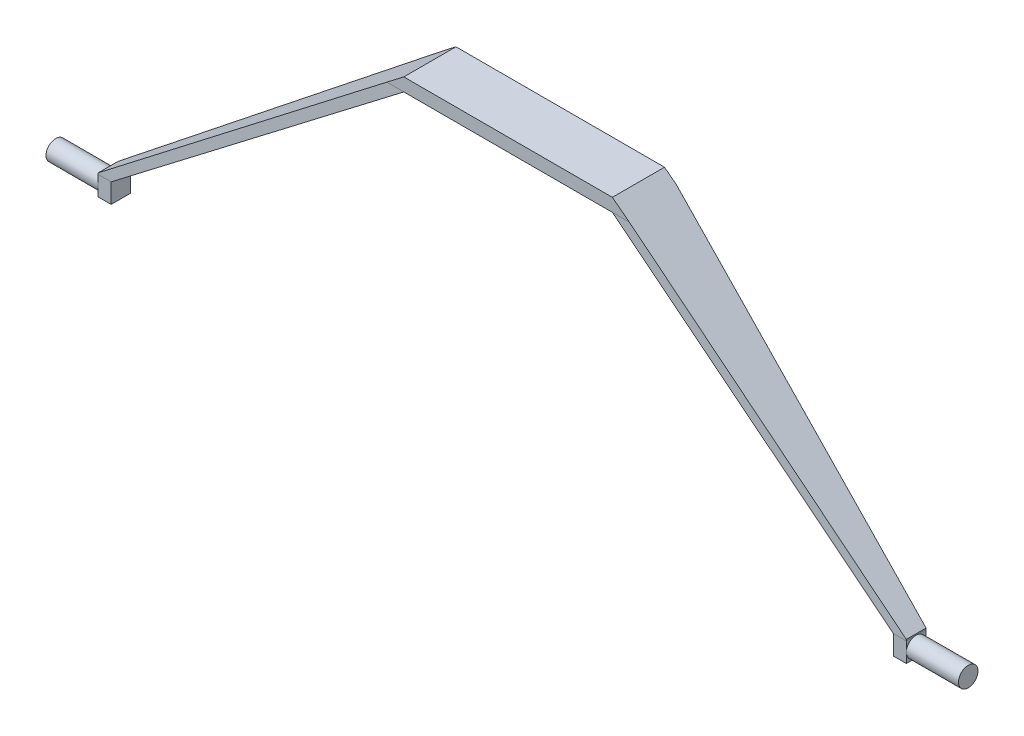
ISO-10303-21;
HEADER;
FILE_DESCRIPTION(('STEP AP214'),'2;1');
FILE_NAME('part.step','',(''),(''),'','','');
FILE_SCHEMA(('AUTOMOTIVE_DESIGN { 1 0 10303 214 1 1 1 1 }'));
ENDSEC;
DATA;
#1=APPLICATION_CONTEXT('core data for automotive mechanical design processes');
#2=APPLICATION_PROTOCOL_DEFINITION('international standard','automotive_design',2000,#1);
#3=PRODUCT_CONTEXT('',#1,'mechanical');
#4=PRODUCT('Part','Part','',(#3));
#5=PRODUCT_RELATED_PRODUCT_CATEGORY('part','',(#4));
#6=PRODUCT_DEFINITION_FORMATION('','',#4);
#7=PRODUCT_DEFINITION_CONTEXT('part definition',#1,'design');
#8=PRODUCT_DEFINITION('design','',#6,#7);
#9=PRODUCT_DEFINITION_SHAPE('','',#8);
#10=(LENGTH_UNIT() NAMED_UNIT(*) SI_UNIT(.MILLI.,.METRE.));
#11=(NAMED_UNIT(*) PLANE_ANGLE_UNIT() SI_UNIT($,.RADIAN.));
#12=(NAMED_UNIT(*) SI_UNIT($,.STERADIAN.) SOLID_ANGLE_UNIT());
#13=UNCERTAINTY_MEASURE_WITH_UNIT(LENGTH_MEASURE(1.E-05),#10,'distance_accuracy_value','');
#14=(GEOMETRIC_REPRESENTATION_CONTEXT(3) GLOBAL_UNCERTAINTY_ASSIGNED_CONTEXT((#13)) GLOBAL_UNIT_ASSIGNED_CONTEXT((#10,
#11,#12)) REPRESENTATION_CONTEXT('',''));
#15=CARTESIAN_POINT('',(0.,0.,0.));
#16=DIRECTION('',(0.,0.,1.));
#17=DIRECTION('',(1.,0.,0.));
#18=AXIS2_PLACEMENT_3D('',#15,#16,#17);
#19=CARTESIAN_POINT('',(0.,215.9,11.43));
#20=DIRECTION('',(0.,-1.,0.));
#21=DIRECTION('',(1.,0.,0.));
#22=AXIS2_PLACEMENT_3D('',#19,#20,#21);
#23=PLANE('',#22);
#24=DIRECTION('',(0.,0.,-1.));
#25=VECTOR('',#24,1.);
#26=CARTESIAN_POINT('',(-203.2,215.9,11.43));
#27=LINE('',#26,#25);
#28=CARTESIAN_POINT('',(-203.2,215.9,0.));
#29=VERTEX_POINT('',#28);
#30=CARTESIAN_POINT('',(-203.2,215.9,-100.20306796752));
#31=VERTEX_POINT('',#30);
#32=EDGE_CURVE('E184',#29,#31,#27,.T.);
#33=ORIENTED_EDGE('',*,*,#32,.T.);
#34=DIRECTION('',(-1.,0.,0.));
#35=VECTOR('',#34,1.);
#36=CARTESIAN_POINT('',(889.072484025787,215.9,-100.20306796752));
#37=LINE('',#36,#35);
#38=CARTESIAN_POINT('',(203.2,215.9,-100.20306796752));
#39=VERTEX_POINT('',#38);
#40=EDGE_CURVE('E165',#39,#31,#37,.T.);
#41=ORIENTED_EDGE('',*,*,#40,.F.);
#42=DIRECTION('',(0.,0.,-1.));
#43=VECTOR('',#42,1.);
#44=CARTESIAN_POINT('',(203.2,215.9,11.43));
#45=LINE('',#44,#43);
#46=CARTESIAN_POINT('',(203.2,215.9,0.));
#47=VERTEX_POINT('',#46);
#48=EDGE_CURVE('E11',#47,#39,#45,.T.);
#49=ORIENTED_EDGE('',*,*,#48,.F.);
#50=DIRECTION('',(1.,0.,0.));
#51=VECTOR('',#50,1.);
#52=CARTESIAN_POINT('',(889.072484025788,215.9,0.));
#53=LINE('',#52,#51);
#54=EDGE_CURVE('E191',#29,#47,#53,.T.);
#55=ORIENTED_EDGE('',*,*,#54,.F.);
#56=EDGE_LOOP('',(#33,#41,#49,#55));
#57=FACE_BOUND('',#56,.T.);
#58=ADVANCED_FACE('F35',(#57),#23,.T.);
#59=CARTESIAN_POINT('',(178.608653813682,234.620555922852,11.43));
#60=DIRECTION('',(-0.605721594983422,-0.795676661320878,0.));
#61=DIRECTION('',(0.795676661320878,-0.605721594983422,0.));
#62=AXIS2_PLACEMENT_3D('',#59,#60,#61);
#63=PLANE('',#62);
#64=ORIENTED_EDGE('',*,*,#48,.T.);
#65=DIRECTION('',(-0.791351832413663,0.602429249749417,-0.104121450152652));
#66=VECTOR('',#65,1.);
#67=CARTESIAN_POINT('',(841.604368216817,-270.09554436941,-16.2055514649283));
#68=LINE('',#67,#66);
#69=CARTESIAN_POINT('',(762.071663752112,-209.55,-26.67));
#70=VERTEX_POINT('',#69);
#71=EDGE_CURVE('E172',#70,#39,#68,.T.);
#72=ORIENTED_EDGE('',*,*,#71,.F.);
#73=DIRECTION('',(0.,0.,-1.));
#74=VECTOR('',#73,1.);
#75=CARTESIAN_POINT('',(762.071663752112,-209.55,11.43));
#76=LINE('',#75,#74);
#77=CARTESIAN_POINT('',(762.071663752112,-209.55,11.43));
#78=VERTEX_POINT('',#77);
#79=EDGE_CURVE('E42',#78,#70,#76,.T.);
#80=ORIENTED_EDGE('',*,*,#79,.F.);
#81=DIRECTION('',(0.795571328940657,-0.605641409022903,0.0162709632274809));
#82=VECTOR('',#81,1.);
#83=CARTESIAN_POINT('',(842.454767838912,-270.742924694243,13.0739890216364));
#84=LINE('',#83,#82);
#85=EDGE_CURVE('E244',#47,#78,#84,.T.);
#86=ORIENTED_EDGE('',*,*,#85,.F.);
#87=EDGE_LOOP('',(#64,#72,#80,#86));
#88=FACE_BOUND('',#87,.T.);
#89=ADVANCED_FACE('F243',(#88),#63,.T.);
#90=CARTESIAN_POINT('',(787.4,0.,11.43));
#91=DIRECTION('',(-1.,0.,0.));
#92=DIRECTION('',(0.,0.,1.));
#93=AXIS2_PLACEMENT_3D('',#90,#91,#92);
#94=PLANE('',#93);
#95=DIRECTION('',(0.,0.985390376076013,-0.170310911972118));
#96=VECTOR('',#95,1.);
#97=CARTESIAN_POINT('',(787.4,-209.55,-26.67));
#98=LINE('',#97,#96);
#99=CARTESIAN_POINT('',(787.4,-209.55,-26.67));
#100=VERTEX_POINT('',#99);
#101=CARTESIAN_POINT('',(787.4,-207.01,-27.1090033908509));
#102=VERTEX_POINT('',#101);
#103=EDGE_CURVE('E246',#100,#102,#98,.T.);
#104=ORIENTED_EDGE('',*,*,#103,.T.);
#105=DIRECTION('',(0.,0.,-1.));
#106=VECTOR('',#105,1.);
#107=CARTESIAN_POINT('',(787.4,-207.01,11.43));
#108=LINE('',#107,#106);
#109=CARTESIAN_POINT('',(787.4,-207.01,11.3617611940298));
#110=VERTEX_POINT('',#109);
#111=EDGE_CURVE('E219',#110,#102,#108,.T.);
#112=ORIENTED_EDGE('',*,*,#111,.F.);
#113=DIRECTION('',(0.,-0.999639313080089,0.0268559815454352));
#114=VECTOR('',#113,1.);
#115=CARTESIAN_POINT('',(787.4,-209.55,11.43));
#116=LINE('',#115,#114);
#117=CARTESIAN_POINT('',(787.4,-209.55,11.43));
#118=VERTEX_POINT('',#117);
#119=EDGE_CURVE('E275',#110,#118,#116,.T.);
#120=ORIENTED_EDGE('',*,*,#119,.T.);
#121=DIRECTION('',(0.,0.,-1.));
#122=VECTOR('',#121,1.);
#123=CARTESIAN_POINT('',(787.4,-209.55,11.43));
#124=LINE('',#123,#122);
#125=EDGE_CURVE('E222',#118,#100,#124,.T.);
#126=ORIENTED_EDGE('',*,*,#125,.T.);
#127=EDGE_LOOP('',(#104,#112,#120,#126));
#128=FACE_BOUND('',#127,.T.);
#129=ADVANCED_FACE('F377',(#128),#94,.F.);
#130=CARTESIAN_POINT('',(191.85340904021,250.007275236534,11.43));
#131=DIRECTION('',(-0.608793543514713,-0.793328696931353,0.));
#132=DIRECTION('',(0.793328696931353,-0.608793543514713,0.));
#133=AXIS2_PLACEMENT_3D('',#130,#131,#132);
#134=PLANE('',#133);
#135=DIRECTION('',(-0.788973141974178,0.605451128514967,-0.104643739532502));
#136=VECTOR('',#135,1.);
#137=CARTESIAN_POINT('',(851.938511109871,-256.536292221271,-18.5490781068317));
#138=LINE('',#137,#136);
#139=CARTESIAN_POINT('',(225.766825324947,223.982414478899,-101.6));
#140=VERTEX_POINT('',#139);
#141=EDGE_CURVE('E252',#102,#140,#138,.T.);
#142=ORIENTED_EDGE('',*,*,#141,.T.);
#143=DIRECTION('',(-0.793328696931354,0.608793543514713,0.));
#144=VECTOR('',#143,1.);
#145=CARTESIAN_POINT('',(191.85340904021,250.007275236534,-101.6));
#146=LINE('',#145,#144);
#147=CARTESIAN_POINT('',(203.2,241.3,-101.6));
#148=VERTEX_POINT('',#147);
#149=EDGE_CURVE('E298',#140,#148,#146,.T.);
#150=ORIENTED_EDGE('',*,*,#149,.T.);
#151=DIRECTION('',(0.,0.,-1.));
#152=VECTOR('',#151,1.);
#153=CARTESIAN_POINT('',(203.2,241.3,11.43));
#154=LINE('',#153,#152);
#155=CARTESIAN_POINT('',(203.2,241.3,0.));
#156=VERTEX_POINT('',#155);
#157=EDGE_CURVE('E216',#156,#148,#154,.T.);
#158=ORIENTED_EDGE('',*,*,#157,.F.);
#159=DIRECTION('',(0.793328696931353,-0.608793543514713,0.));
#160=VECTOR('',#159,1.);
#161=CARTESIAN_POINT('',(634.86785428069,-89.9581577414864,0.));
#162=LINE('',#161,#160);
#163=CARTESIAN_POINT('',(236.299150141643,215.9,0.));
#164=VERTEX_POINT('',#163);
#165=EDGE_CURVE('E269',#156,#164,#162,.T.);
#166=ORIENTED_EDGE('',*,*,#165,.T.);
#167=DIRECTION('',(0.793222607645185,-0.608712131519023,0.0163534602497648));
#168=VECTOR('',#167,1.);
#169=CARTESIAN_POINT('',(852.599850516971,-257.043798331502,12.7059527909956));
#170=LINE('',#169,#168);
#171=EDGE_CURVE('E272',#164,#110,#170,.T.);
#172=ORIENTED_EDGE('',*,*,#171,.T.);
#173=ORIENTED_EDGE('',*,*,#111,.T.);
#174=EDGE_LOOP('',(#142,#150,#158,#166,#172,#173));
#175=FACE_BOUND('',#174,.T.);
#176=ADVANCED_FACE('F359',(#175),#134,.F.);
#177=CARTESIAN_POINT('',(-191.85340904021,250.007275236534,11.43));
#178=DIRECTION('',(-0.608793543514713,0.793328696931354,0.));
#179=DIRECTION('',(-0.793328696931354,-0.608793543514713,0.));
#180=AXIS2_PLACEMENT_3D('',#177,#178,#179);
#181=PLANE('',#180);
#182=DIRECTION('',(0.793328696931354,0.608793543514713,0.));
#183=VECTOR('',#182,1.);
#184=CARTESIAN_POINT('',(-191.85340904021,250.007275236534,-101.6));
#185=LINE('',#184,#183);
#186=CARTESIAN_POINT('',(-225.766825324947,223.982414478899,-101.6));
#187=VERTEX_POINT('',#186);
#188=CARTESIAN_POINT('',(-203.2,241.3,-101.6));
#189=VERTEX_POINT('',#188);
#190=EDGE_CURVE('E306',#187,#189,#185,.T.);
#191=ORIENTED_EDGE('',*,*,#190,.F.);
#192=DIRECTION('',(-0.788973141974178,-0.605451128514967,0.104643739532502));
#193=VECTOR('',#192,1.);
#194=CARTESIAN_POINT('',(-851.938511109871,-256.536292221271,-18.5490781068318));
#195=LINE('',#194,#193);
#196=CARTESIAN_POINT('',(-787.4,-207.01,-27.109003390851));
#197=VERTEX_POINT('',#196);
#198=EDGE_CURVE('E49',#187,#197,#195,.T.);
#199=ORIENTED_EDGE('',*,*,#198,.T.);
#200=DIRECTION('',(0.,0.,-1.));
#201=VECTOR('',#200,1.);
#202=CARTESIAN_POINT('',(-787.4,-207.01,11.43));
#203=LINE('',#202,#201);
#204=CARTESIAN_POINT('',(-787.4,-207.01,11.3617611940298));
#205=VERTEX_POINT('',#204);
#206=EDGE_CURVE('E210',#205,#197,#203,.T.);
#207=ORIENTED_EDGE('',*,*,#206,.F.);
#208=DIRECTION('',(0.793222607645185,0.608712131519023,-0.0163534602497648));
#209=VECTOR('',#208,1.);
#210=CARTESIAN_POINT('',(-852.599850516971,-257.043798331502,12.7059527909955));
#211=LINE('',#210,#209);
#212=CARTESIAN_POINT('',(-236.299150141643,215.9,0.));
#213=VERTEX_POINT('',#212);
#214=EDGE_CURVE('E265',#205,#213,#211,.T.);
#215=ORIENTED_EDGE('',*,*,#214,.T.);
#216=DIRECTION('',(0.793328696931354,0.608793543514713,0.));
#217=VECTOR('',#216,1.);
#218=CARTESIAN_POINT('',(-634.86785428069,-89.9581577414863,0.));
#219=LINE('',#218,#217);
#220=CARTESIAN_POINT('',(-203.2,241.3,0.));
#221=VERTEX_POINT('',#220);
#222=EDGE_CURVE('E245',#213,#221,#219,.T.);
#223=ORIENTED_EDGE('',*,*,#222,.T.);
#224=DIRECTION('',(0.,0.,-1.));
#225=VECTOR('',#224,1.);
#226=CARTESIAN_POINT('',(-203.2,241.3,11.43));
#227=LINE('',#226,#225);
#228=EDGE_CURVE('E213',#221,#189,#227,.T.);
#229=ORIENTED_EDGE('',*,*,#228,.T.);
#230=EDGE_LOOP('',(#191,#199,#207,#215,#223,#229));
#231=FACE_BOUND('',#230,.T.);
#232=ADVANCED_FACE('F538',(#231),#181,.T.);
#233=CARTESIAN_POINT('',(-787.003065002281,1.48030426671114,11.43));
#234=DIRECTION('',(-0.999998231040107,0.00188093504833806,0.));
#235=DIRECTION('',(-0.00188093504833806,-0.999998231040108,0.));
#236=AXIS2_PLACEMENT_3D('',#233,#234,#235);
#237=PLANE('',#236);
#238=DIRECTION('',(-0.00188093504833806,-0.999998231040108,0.));
#239=VECTOR('',#238,1.);
#240=CARTESIAN_POINT('',(-787.472023207346,-247.841104205737,-26.67));
#241=LINE('',#240,#239);
#242=CARTESIAN_POINT('',(-787.435831939441,-228.600033698686,-26.67));
#243=VERTEX_POINT('',#242);
#244=CARTESIAN_POINT('',(-787.471663752112,-247.65,-26.67));
#245=VERTEX_POINT('',#244);
#246=EDGE_CURVE('E337',#243,#245,#241,.T.);
#247=ORIENTED_EDGE('',*,*,#246,.T.);
#248=DIRECTION('',(0.,0.,-1.));
#249=VECTOR('',#248,1.);
#250=CARTESIAN_POINT('',(-787.471663752112,-247.65,11.43));
#251=LINE('',#250,#249);
#252=CARTESIAN_POINT('',(-787.471663752112,-247.65,-7.61999999999999));
#253=VERTEX_POINT('',#252);
#254=EDGE_CURVE('E203',#253,#245,#251,.T.);
#255=ORIENTED_EDGE('',*,*,#254,.F.);
#256=CARTESIAN_POINT('',(-787.435831939442,-228.600033698686,-7.62));
#257=DIRECTION('',(-0.999998231040108,0.00188093504833806,0.));
#258=DIRECTION('',(-0.00188093504833806,-0.999998231040108,0.));
#259=AXIS2_PLACEMENT_3D('',#256,#257,#258);
#260=CIRCLE('',#259,19.05);
#261=EDGE_CURVE('E290',#243,#253,#260,.T.);
#262=ORIENTED_EDGE('',*,*,#261,.F.);
#263=EDGE_LOOP('',(#247,#255,#262));
#264=FACE_BOUND('',#263,.T.);
#265=ADVANCED_FACE('F410',(#264),#237,.T.);
#266=CARTESIAN_POINT('',(762.071663752112,0.,11.43));
#267=DIRECTION('',(-1.,0.,0.));
#268=DIRECTION('',(0.,0.,1.));
#269=AXIS2_PLACEMENT_3D('',#266,#267,#268);
#270=PLANE('',#269);
#271=ORIENTED_EDGE('',*,*,#79,.T.);
#272=DIRECTION('',(0.,1.,0.));
#273=VECTOR('',#272,1.);
#274=CARTESIAN_POINT('',(762.071663752112,-247.65,-26.67));
#275=LINE('',#274,#273);
#276=CARTESIAN_POINT('',(762.071663752112,-247.65,-26.67));
#277=VERTEX_POINT('',#276);
#278=EDGE_CURVE('E238',#277,#70,#275,.T.);
#279=ORIENTED_EDGE('',*,*,#278,.F.);
#280=DIRECTION('',(0.,0.,-1.));
#281=VECTOR('',#280,1.);
#282=CARTESIAN_POINT('',(762.071663752112,-247.65,11.43));
#283=LINE('',#282,#281);
#284=CARTESIAN_POINT('',(762.071663752112,-247.65,11.43));
#285=VERTEX_POINT('',#284);
#286=EDGE_CURVE('E229',#285,#277,#283,.T.);
#287=ORIENTED_EDGE('',*,*,#286,.F.);
#288=DIRECTION('',(0.,1.,0.));
#289=VECTOR('',#288,1.);
#290=CARTESIAN_POINT('',(762.071663752112,0.,11.43));
#291=LINE('',#290,#289);
#292=EDGE_CURVE('E240',#285,#78,#291,.T.);
#293=ORIENTED_EDGE('',*,*,#292,.T.);
#294=EDGE_LOOP('',(#271,#279,#287,#293));
#295=FACE_BOUND('',#294,.T.);
#296=ADVANCED_FACE('F236',(#295),#270,.T.);
#297=CARTESIAN_POINT('',(0.,-247.65,11.43));
#298=DIRECTION('',(0.,-1.,0.));
#299=DIRECTION('',(0.,0.,-1.));
#300=AXIS2_PLACEMENT_3D('',#297,#298,#299);
#301=PLANE('',#300);
#302=ORIENTED_EDGE('',*,*,#286,.T.);
#303=DIRECTION('',(-1.,0.,0.));
#304=VECTOR('',#303,1.);
#305=CARTESIAN_POINT('',(889.072484025788,-247.65,-26.67));
#306=LINE('',#305,#304);
#307=CARTESIAN_POINT('',(787.471663752112,-247.65,-26.67));
#308=VERTEX_POINT('',#307);
#309=EDGE_CURVE('E355',#308,#277,#306,.T.);
#310=ORIENTED_EDGE('',*,*,#309,.F.);
#311=DIRECTION('',(0.,0.,-1.));
#312=VECTOR('',#311,1.);
#313=CARTESIAN_POINT('',(787.471663752112,-247.65,11.43));
#314=LINE('',#313,#312);
#315=CARTESIAN_POINT('',(787.471663752112,-247.65,-7.62));
#316=VERTEX_POINT('',#315);
#317=EDGE_CURVE('E225',#316,#308,#314,.T.);
#318=ORIENTED_EDGE('',*,*,#317,.F.);
#319=CARTESIAN_POINT('',(787.471663752112,-247.65,11.43));
#320=VERTEX_POINT('',#319);
#321=EDGE_CURVE('E226',#320,#316,#314,.T.);
#322=ORIENTED_EDGE('',*,*,#321,.F.);
#323=DIRECTION('',(-1.,0.,0.));
#324=VECTOR('',#323,1.);
#325=CARTESIAN_POINT('',(0.,-247.65,11.43));
#326=LINE('',#325,#324);
#327=EDGE_CURVE('E309',#320,#285,#326,.T.);
#328=ORIENTED_EDGE('',*,*,#327,.T.);
#329=EDGE_LOOP('',(#302,#310,#318,#322,#328));
#330=FACE_BOUND('',#329,.T.);
#331=ADVANCED_FACE('F398',(#330),#301,.T.);
#332=CARTESIAN_POINT('',(787.003065002281,1.48030426671114,11.43));
#333=DIRECTION('',(-0.999998231040107,-0.00188093504833806,0.));
#334=DIRECTION('',(0.00188093504833806,-0.999998231040108,0.));
#335=AXIS2_PLACEMENT_3D('',#332,#333,#334);
#336=PLANE('',#335);
#337=DIRECTION('',(-0.00188093504833806,0.999998231040108,0.));
#338=VECTOR('',#337,1.);
#339=CARTESIAN_POINT('',(787.472023207346,-247.841104205737,-26.67));
#340=LINE('',#339,#338);
#341=CARTESIAN_POINT('',(787.435831939441,-228.600033698686,-26.67));
#342=VERTEX_POINT('',#341);
#343=EDGE_CURVE('E176',#342,#100,#340,.T.);
#344=ORIENTED_EDGE('',*,*,#343,.T.);
#345=ORIENTED_EDGE('',*,*,#125,.F.);
#346=DIRECTION('',(-0.00188093504833806,0.999998231040107,0.));
#347=VECTOR('',#346,1.);
#348=CARTESIAN_POINT('',(787.003065002281,1.48030426671114,11.43));
#349=LINE('',#348,#347);
#350=CARTESIAN_POINT('',(787.435831939442,-228.600033698686,11.43));
#351=VERTEX_POINT('',#350);
#352=EDGE_CURVE('E312',#351,#118,#349,.T.);
#353=ORIENTED_EDGE('',*,*,#352,.F.);
#354=CARTESIAN_POINT('',(787.435831939442,-228.600033698686,-7.62));
#355=DIRECTION('',(-0.999998231040108,-0.00188093504833806,0.));
#356=DIRECTION('',(0.00188093504833806,-0.999998231040108,0.));
#357=AXIS2_PLACEMENT_3D('',#354,#355,#356);
#358=CIRCLE('',#357,19.05);
#359=EDGE_CURVE('E294',#351,#342,#358,.T.);
#360=ORIENTED_EDGE('',*,*,#359,.T.);
#361=EDGE_LOOP('',(#344,#345,#353,#360));
#362=FACE_BOUND('',#361,.T.);
#363=ADVANCED_FACE('F387',(#362),#336,.F.);
#364=EDGE_CURVE('E348',#308,#342,#340,.T.);
#365=ORIENTED_EDGE('',*,*,#364,.T.);
#366=EDGE_CURVE('E57',#342,#316,#358,.T.);
#367=ORIENTED_EDGE('',*,*,#366,.T.);
#368=ORIENTED_EDGE('',*,*,#317,.T.);
#369=EDGE_LOOP('',(#365,#367,#368));
#370=FACE_BOUND('',#369,.T.);
#371=ADVANCED_FACE('F392',(#370),#336,.F.);
#372=CARTESIAN_POINT('',(-787.4,0.,11.43));
#373=DIRECTION('',(-1.,0.,0.));
#374=DIRECTION('',(0.,0.,1.));
#375=AXIS2_PLACEMENT_3D('',#372,#373,#374);
#376=PLANE('',#375);
#377=ORIENTED_EDGE('',*,*,#206,.T.);
#378=DIRECTION('',(0.,-0.985390376076013,0.170310911972118));
#379=VECTOR('',#378,1.);
#380=CARTESIAN_POINT('',(-787.4,-209.55,-26.67));
#381=LINE('',#380,#379);
#382=CARTESIAN_POINT('',(-787.4,-209.55,-26.6700000000001));
#383=VERTEX_POINT('',#382);
#384=EDGE_CURVE('E187',#197,#383,#381,.T.);
#385=ORIENTED_EDGE('',*,*,#384,.T.);
#386=DIRECTION('',(0.,0.,-1.));
#387=VECTOR('',#386,1.);
#388=CARTESIAN_POINT('',(-787.4,-209.55,11.43));
#389=LINE('',#388,#387);
#390=CARTESIAN_POINT('',(-787.4,-209.55,11.43));
#391=VERTEX_POINT('',#390);
#392=EDGE_CURVE('E207',#391,#383,#389,.T.);
#393=ORIENTED_EDGE('',*,*,#392,.F.);
#394=DIRECTION('',(0.,0.999639313080089,-0.0268559815454352));
#395=VECTOR('',#394,1.);
#396=CARTESIAN_POINT('',(-787.4,-209.55,11.43));
#397=LINE('',#396,#395);
#398=EDGE_CURVE('E262',#391,#205,#397,.T.);
#399=ORIENTED_EDGE('',*,*,#398,.T.);
#400=EDGE_LOOP('',(#377,#385,#393,#399));
#401=FACE_BOUND('',#400,.T.);
#402=ADVANCED_FACE('F416',(#401),#376,.T.);
#403=CARTESIAN_POINT('',(-178.608653813682,234.620555922852,11.43));
#404=DIRECTION('',(-0.605721594983422,0.795676661320878,0.));
#405=DIRECTION('',(-0.795676661320878,-0.605721594983422,0.));
#406=AXIS2_PLACEMENT_3D('',#403,#404,#405);
#407=PLANE('',#406);
#408=DIRECTION('',(-0.791351832413664,-0.602429249749417,0.104121450152652));
#409=VECTOR('',#408,1.);
#410=CARTESIAN_POINT('',(-841.604368216818,-270.095544369409,-16.2055514649284));
#411=LINE('',#410,#409);
#412=CARTESIAN_POINT('',(-762.071663752112,-209.55,-26.6700000000001));
#413=VERTEX_POINT('',#412);
#414=EDGE_CURVE('E169',#31,#413,#411,.T.);
#415=ORIENTED_EDGE('',*,*,#414,.F.);
#416=ORIENTED_EDGE('',*,*,#32,.F.);
#417=DIRECTION('',(0.795571328940657,0.605641409022902,-0.0162709632274809));
#418=VECTOR('',#417,1.);
#419=CARTESIAN_POINT('',(-842.454767838912,-270.742924694243,13.0739890216364));
#420=LINE('',#419,#418);
#421=CARTESIAN_POINT('',(-762.071663752113,-209.55,11.43));
#422=VERTEX_POINT('',#421);
#423=EDGE_CURVE('E258',#422,#29,#420,.T.);
#424=ORIENTED_EDGE('',*,*,#423,.F.);
#425=DIRECTION('',(0.,0.,-1.));
#426=VECTOR('',#425,1.);
#427=CARTESIAN_POINT('',(-762.071663752112,-209.55,11.43));
#428=LINE('',#427,#426);
#429=EDGE_CURVE('E186',#422,#413,#428,.T.);
#430=ORIENTED_EDGE('',*,*,#429,.T.);
#431=EDGE_LOOP('',(#415,#416,#424,#430));
#432=FACE_BOUND('',#431,.T.);
#433=ADVANCED_FACE('F182',(#432),#407,.F.);
#434=CARTESIAN_POINT('',(0.,0.,-101.6));
#435=DIRECTION('',(0.,0.,1.));
#436=DIRECTION('',(1.,0.,0.));
#437=AXIS2_PLACEMENT_3D('',#434,#435,#436);
#438=PLANE('',#437);
#439=DIRECTION('',(-1.,0.,0.));
#440=VECTOR('',#439,1.);
#441=CARTESIAN_POINT('',(889.072484025788,223.982414478899,-101.6));
#442=LINE('',#441,#440);
#443=EDGE_CURVE('E353',#140,#187,#442,.T.);
#444=ORIENTED_EDGE('',*,*,#443,.T.);
#445=ORIENTED_EDGE('',*,*,#190,.T.);
#446=DIRECTION('',(1.,0.,0.));
#447=VECTOR('',#446,1.);
#448=CARTESIAN_POINT('',(0.,241.3,-101.6));
#449=LINE('',#448,#447);
#450=EDGE_CURVE('E303',#189,#148,#449,.T.);
#451=ORIENTED_EDGE('',*,*,#450,.T.);
#452=ORIENTED_EDGE('',*,*,#149,.F.);
#453=EDGE_LOOP('',(#444,#445,#451,#452));
#454=FACE_BOUND('',#453,.T.);
#455=ADVANCED_FACE('F363',(#454),#438,.F.);
#456=CARTESIAN_POINT('',(0.,241.3,11.43));
#457=DIRECTION('',(0.,1.,0.));
#458=DIRECTION('',(-1.,0.,0.));
#459=AXIS2_PLACEMENT_3D('',#456,#457,#458);
#460=PLANE('',#459);
#461=ORIENTED_EDGE('',*,*,#228,.F.);
#462=DIRECTION('',(-1.,0.,0.));
#463=VECTOR('',#462,1.);
#464=CARTESIAN_POINT('',(889.072484025788,241.3,0.));
#465=LINE('',#464,#463);
#466=EDGE_CURVE('E279',#156,#221,#465,.T.);
#467=ORIENTED_EDGE('',*,*,#466,.F.);
#468=ORIENTED_EDGE('',*,*,#157,.T.);
#469=ORIENTED_EDGE('',*,*,#450,.F.);
#470=EDGE_LOOP('',(#461,#467,#468,#469));
#471=FACE_BOUND('',#470,.T.);
#472=ADVANCED_FACE('F368',(#471),#460,.T.);
#473=CARTESIAN_POINT('',(0.,0.,11.43));
#474=DIRECTION('',(0.,0.,1.));
#475=DIRECTION('',(1.,0.,0.));
#476=AXIS2_PLACEMENT_3D('',#473,#474,#475);
#477=PLANE('',#476);
#478=ORIENTED_EDGE('',*,*,#352,.T.);
#479=DIRECTION('',(-1.,0.,0.));
#480=VECTOR('',#479,1.);
#481=CARTESIAN_POINT('',(889.072484025788,-209.55,11.43));
#482=LINE('',#481,#480);
#483=EDGE_CURVE('E284',#118,#78,#482,.T.);
#484=ORIENTED_EDGE('',*,*,#483,.T.);
#485=ORIENTED_EDGE('',*,*,#292,.F.);
#486=ORIENTED_EDGE('',*,*,#327,.F.);
#487=EDGE_CURVE('E313',#320,#351,#349,.T.);
#488=ORIENTED_EDGE('',*,*,#487,.T.);
#489=EDGE_LOOP('',(#478,#484,#485,#486,#488));
#490=FACE_BOUND('',#489,.T.);
#491=ADVANCED_FACE('F381',(#490),#477,.T.);
#492=ORIENTED_EDGE('',*,*,#321,.T.);
#493=EDGE_CURVE('E291',#316,#351,#358,.T.);
#494=ORIENTED_EDGE('',*,*,#493,.T.);
#495=ORIENTED_EDGE('',*,*,#487,.F.);
#496=EDGE_LOOP('',(#492,#494,#495));
#497=FACE_BOUND('',#496,.T.);
#498=ADVANCED_FACE('F399',(#497),#336,.F.);
#499=EDGE_CURVE('E188',#383,#243,#241,.T.);
#500=ORIENTED_EDGE('',*,*,#499,.T.);
#501=CARTESIAN_POINT('',(-787.435831939442,-228.600033698686,11.43));
#502=VERTEX_POINT('',#501);
#503=EDGE_CURVE('E301',#502,#243,#260,.T.);
#504=ORIENTED_EDGE('',*,*,#503,.F.);
#505=DIRECTION('',(0.00188093504833806,0.999998231040107,0.));
#506=VECTOR('',#505,1.);
#507=CARTESIAN_POINT('',(-787.003065002281,1.48030426671114,11.43));
#508=LINE('',#507,#506);
#509=EDGE_CURVE('E316',#502,#391,#508,.T.);
#510=ORIENTED_EDGE('',*,*,#509,.T.);
#511=ORIENTED_EDGE('',*,*,#392,.T.);
#512=EDGE_LOOP('',(#500,#504,#510,#511));
#513=FACE_BOUND('',#512,.T.);
#514=ADVANCED_FACE('F401',(#513),#237,.T.);
#515=CARTESIAN_POINT('',(-787.471663752112,-247.65,11.43));
#516=VERTEX_POINT('',#515);
#517=EDGE_CURVE('E317',#516,#502,#508,.T.);
#518=ORIENTED_EDGE('',*,*,#517,.T.);
#519=EDGE_CURVE('E299',#253,#502,#260,.T.);
#520=ORIENTED_EDGE('',*,*,#519,.F.);
#521=EDGE_CURVE('E204',#516,#253,#251,.T.);
#522=ORIENTED_EDGE('',*,*,#521,.F.);
#523=EDGE_LOOP('',(#518,#520,#522));
#524=FACE_BOUND('',#523,.T.);
#525=ADVANCED_FACE('F407',(#524),#237,.T.);
#526=CARTESIAN_POINT('',(0.,-247.65,11.43));
#527=DIRECTION('',(0.,1.,0.));
#528=DIRECTION('',(0.,0.,1.));
#529=AXIS2_PLACEMENT_3D('',#526,#527,#528);
#530=PLANE('',#529);
#531=ORIENTED_EDGE('',*,*,#254,.T.);
#532=DIRECTION('',(1.,0.,0.));
#533=VECTOR('',#532,1.);
#534=CARTESIAN_POINT('',(-889.072484025788,-247.65,-26.67));
#535=LINE('',#534,#533);
#536=CARTESIAN_POINT('',(-762.071663752112,-247.65,-26.67));
#537=VERTEX_POINT('',#536);
#538=EDGE_CURVE('E331',#245,#537,#535,.T.);
#539=ORIENTED_EDGE('',*,*,#538,.T.);
#540=DIRECTION('',(0.,0.,-1.));
#541=VECTOR('',#540,1.);
#542=CARTESIAN_POINT('',(-762.071663752112,-247.65,11.43));
#543=LINE('',#542,#541);
#544=CARTESIAN_POINT('',(-762.071663752112,-247.65,11.43));
#545=VERTEX_POINT('',#544);
#546=EDGE_CURVE('E194',#545,#537,#543,.T.);
#547=ORIENTED_EDGE('',*,*,#546,.F.);
#548=DIRECTION('',(1.,0.,0.));
#549=VECTOR('',#548,1.);
#550=CARTESIAN_POINT('',(0.,-247.65,11.43));
#551=LINE('',#550,#549);
#552=EDGE_CURVE('E197',#516,#545,#551,.T.);
#553=ORIENTED_EDGE('',*,*,#552,.F.);
#554=ORIENTED_EDGE('',*,*,#521,.T.);
#555=EDGE_LOOP('',(#531,#539,#547,#553,#554));
#556=FACE_BOUND('',#555,.T.);
#557=ADVANCED_FACE('F330',(#556),#530,.F.);
#558=CARTESIAN_POINT('',(-762.071663752112,0.,11.43));
#559=DIRECTION('',(-1.,0.,0.));
#560=DIRECTION('',(0.,0.,1.));
#561=AXIS2_PLACEMENT_3D('',#558,#559,#560);
#562=PLANE('',#561);
#563=ORIENTED_EDGE('',*,*,#546,.T.);
#564=DIRECTION('',(0.,-1.,0.));
#565=VECTOR('',#564,1.);
#566=CARTESIAN_POINT('',(-762.071663752112,-247.65,-26.67));
#567=LINE('',#566,#565);
#568=EDGE_CURVE('E335',#413,#537,#567,.T.);
#569=ORIENTED_EDGE('',*,*,#568,.F.);
#570=ORIENTED_EDGE('',*,*,#429,.F.);
#571=DIRECTION('',(0.,1.,0.));
#572=VECTOR('',#571,1.);
#573=CARTESIAN_POINT('',(-762.071663752112,0.,11.43));
#574=LINE('',#573,#572);
#575=EDGE_CURVE('E192',#545,#422,#574,.T.);
#576=ORIENTED_EDGE('',*,*,#575,.F.);
#577=EDGE_LOOP('',(#563,#569,#570,#576));
#578=FACE_BOUND('',#577,.T.);
#579=ADVANCED_FACE('F334',(#578),#562,.F.);
#580=DIRECTION('',(1.,0.,0.));
#581=VECTOR('',#580,1.);
#582=CARTESIAN_POINT('',(-889.072484025788,-209.55,11.43));
#583=LINE('',#582,#581);
#584=EDGE_CURVE('E249',#391,#422,#583,.T.);
#585=ORIENTED_EDGE('',*,*,#584,.F.);
#586=ORIENTED_EDGE('',*,*,#509,.F.);
#587=ORIENTED_EDGE('',*,*,#517,.F.);
#588=ORIENTED_EDGE('',*,*,#552,.T.);
#589=ORIENTED_EDGE('',*,*,#575,.T.);
#590=EDGE_LOOP('',(#585,#586,#587,#588,#589));
#591=FACE_BOUND('',#590,.T.);
#592=ADVANCED_FACE('F324',(#591),#477,.T.);
#593=CARTESIAN_POINT('',(-889.035652213117,-228.408930697775,-7.62));
#594=DIRECTION('',(0.999998231040107,-0.00188093504833806,0.));
#595=DIRECTION('',(0.00188093504833806,0.999998231040108,0.));
#596=AXIS2_PLACEMENT_3D('',#593,#594,#595);
#597=CYLINDRICAL_SURFACE('',#596,19.05);
#598=CARTESIAN_POINT('',(-889.035652213117,-228.408930697775,-7.62));
#599=DIRECTION('',(-0.999998231040108,0.00188093504833806,0.));
#600=DIRECTION('',(-0.00188093504833806,-0.999998231040108,0.));
#601=AXIS2_PLACEMENT_3D('',#598,#599,#600);
#602=CIRCLE('',#601,19.05);
#603=CARTESIAN_POINT('',(-889.071484025788,-247.458896999089,-7.62));
#604=VERTEX_POINT('',#603);
#605=EDGE_CURVE('E295',#604,#604,#602,.T.);
#606=ORIENTED_EDGE('',*,*,#605,.F.);
#607=EDGE_LOOP('',(#606));
#608=FACE_BOUND('',#607,.T.);
#609=ORIENTED_EDGE('',*,*,#519,.T.);
#610=ORIENTED_EDGE('',*,*,#503,.T.);
#611=ORIENTED_EDGE('',*,*,#261,.T.);
#612=EDGE_LOOP('',(#609,#610,#611));
#613=FACE_BOUND('',#612,.T.);
#614=ADVANCED_FACE('F481',(#608,#613),#597,.T.);
#615=CARTESIAN_POINT('',(-889.035652213117,-228.408930697775,-7.62));
#616=DIRECTION('',(-0.999998231040108,0.00188093504833806,0.));
#617=DIRECTION('',(-0.00188093504833806,-0.999998231040108,0.));
#618=AXIS2_PLACEMENT_3D('',#615,#616,#617);
#619=PLANE('',#618);
#620=ORIENTED_EDGE('',*,*,#605,.T.);
#621=EDGE_LOOP('',(#620));
#622=FACE_BOUND('',#621,.T.);
#623=ADVANCED_FACE('F593',(#622),#619,.T.);
#624=CARTESIAN_POINT('',(889.035652213117,-228.408930697775,-7.62));
#625=DIRECTION('',(-0.999998231040107,-0.00188093504833806,0.));
#626=DIRECTION('',(0.00188093504833806,-0.999998231040108,0.));
#627=AXIS2_PLACEMENT_3D('',#624,#625,#626);
#628=CYLINDRICAL_SURFACE('',#627,19.05);
#629=CARTESIAN_POINT('',(889.035652213117,-228.408930697775,-7.62));
#630=DIRECTION('',(-0.999998231040108,-0.00188093504833806,0.));
#631=DIRECTION('',(0.00188093504833806,-0.999998231040108,0.));
#632=AXIS2_PLACEMENT_3D('',#629,#630,#631);
#633=CIRCLE('',#632,19.05);
#634=CARTESIAN_POINT('',(889.071484025788,-247.458896999089,-7.62));
#635=VERTEX_POINT('',#634);
#636=EDGE_CURVE('E287',#635,#635,#633,.T.);
#637=ORIENTED_EDGE('',*,*,#636,.T.);
#638=EDGE_LOOP('',(#637));
#639=FACE_BOUND('',#638,.T.);
#640=ORIENTED_EDGE('',*,*,#493,.F.);
#641=ORIENTED_EDGE('',*,*,#366,.F.);
#642=ORIENTED_EDGE('',*,*,#359,.F.);
#643=EDGE_LOOP('',(#640,#641,#642));
#644=FACE_BOUND('',#643,.T.);
#645=ADVANCED_FACE('F395',(#639,#644),#628,.T.);
#646=CARTESIAN_POINT('',(889.035652213117,-228.408930697775,-7.62));
#647=DIRECTION('',(0.999998231040108,0.00188093504833806,0.));
#648=DIRECTION('',(0.00188093504833806,-0.999998231040108,0.));
#649=AXIS2_PLACEMENT_3D('',#646,#647,#648);
#650=PLANE('',#649);
#651=ORIENTED_EDGE('',*,*,#636,.F.);
#652=EDGE_LOOP('',(#651));
#653=FACE_BOUND('',#652,.T.);
#654=ADVANCED_FACE('F493',(#653),#650,.T.);
#655=CARTESIAN_POINT('',(889.072484025788,-209.55,11.43));
#656=DIRECTION('',(0.,0.0268559815454352,0.999639313080089));
#657=DIRECTION('',(0.,-0.999639313080089,0.0268559815454352));
#658=AXIS2_PLACEMENT_3D('',#655,#656,#657);
#659=PLANE('',#658);
#660=ORIENTED_EDGE('',*,*,#85,.T.);
#661=ORIENTED_EDGE('',*,*,#483,.F.);
#662=ORIENTED_EDGE('',*,*,#119,.F.);
#663=ORIENTED_EDGE('',*,*,#171,.F.);
#664=DIRECTION('',(-1.,0.,0.));
#665=VECTOR('',#664,1.);
#666=CARTESIAN_POINT('',(889.072484025788,215.9,0.));
#667=LINE('',#666,#665);
#668=EDGE_CURVE('E281',#164,#47,#667,.T.);
#669=ORIENTED_EDGE('',*,*,#668,.T.);
#670=EDGE_LOOP('',(#660,#661,#662,#663,#669));
#671=FACE_BOUND('',#670,.T.);
#672=ADVANCED_FACE('F374',(#671),#659,.T.);
#673=CARTESIAN_POINT('',(889.072484025788,241.3,0.));
#674=DIRECTION('',(0.,0.,1.));
#675=DIRECTION('',(1.,0.,0.));
#676=AXIS2_PLACEMENT_3D('',#673,#674,#675);
#677=PLANE('',#676);
#678=ORIENTED_EDGE('',*,*,#466,.T.);
#679=ORIENTED_EDGE('',*,*,#222,.F.);
#680=DIRECTION('',(1.,0.,0.));
#681=VECTOR('',#680,1.);
#682=CARTESIAN_POINT('',(-889.072484025788,215.9,0.));
#683=LINE('',#682,#681);
#684=EDGE_CURVE('E256',#213,#29,#683,.T.);
#685=ORIENTED_EDGE('',*,*,#684,.T.);
#686=ORIENTED_EDGE('',*,*,#54,.T.);
#687=ORIENTED_EDGE('',*,*,#668,.F.);
#688=ORIENTED_EDGE('',*,*,#165,.F.);
#689=EDGE_LOOP('',(#678,#679,#685,#686,#687,#688));
#690=FACE_BOUND('',#689,.T.);
#691=ADVANCED_FACE('F372',(#690),#677,.T.);
#692=CARTESIAN_POINT('',(-889.072484025788,-209.55,11.43));
#693=DIRECTION('',(0.,-0.0268559815454352,-0.999639313080089));
#694=DIRECTION('',(0.,0.999639313080089,-0.0268559815454352));
#695=AXIS2_PLACEMENT_3D('',#692,#693,#694);
#696=PLANE('',#695);
#697=ORIENTED_EDGE('',*,*,#398,.F.);
#698=ORIENTED_EDGE('',*,*,#584,.T.);
#699=ORIENTED_EDGE('',*,*,#423,.T.);
#700=ORIENTED_EDGE('',*,*,#684,.F.);
#701=ORIENTED_EDGE('',*,*,#214,.F.);
#702=EDGE_LOOP('',(#697,#698,#699,#700,#701));
#703=FACE_BOUND('',#702,.T.);
#704=ADVANCED_FACE('F503',(#703),#696,.F.);
#705=CARTESIAN_POINT('',(889.072484025788,-247.65,-26.67));
#706=DIRECTION('',(0.,0.,-1.));
#707=DIRECTION('',(0.,1.,0.));
#708=AXIS2_PLACEMENT_3D('',#705,#706,#707);
#709=PLANE('',#708);
#710=ORIENTED_EDGE('',*,*,#278,.T.);
#711=DIRECTION('',(-1.,0.,0.));
#712=VECTOR('',#711,1.);
#713=CARTESIAN_POINT('',(889.072484025788,-209.55,-26.67));
#714=LINE('',#713,#712);
#715=EDGE_CURVE('E351',#100,#70,#714,.T.);
#716=ORIENTED_EDGE('',*,*,#715,.F.);
#717=ORIENTED_EDGE('',*,*,#343,.F.);
#718=ORIENTED_EDGE('',*,*,#364,.F.);
#719=ORIENTED_EDGE('',*,*,#309,.T.);
#720=EDGE_LOOP('',(#710,#716,#717,#718,#719));
#721=FACE_BOUND('',#720,.T.);
#722=ADVANCED_FACE('F390',(#721),#709,.T.);
#723=CARTESIAN_POINT('',(889.072484025788,-209.55,-26.67));
#724=DIRECTION('',(0.,-0.170310911972118,-0.985390376076013));
#725=DIRECTION('',(0.,0.985390376076013,-0.170310911972118));
#726=AXIS2_PLACEMENT_3D('',#723,#724,#725);
#727=PLANE('',#726);
#728=ORIENTED_EDGE('',*,*,#40,.T.);
#729=ORIENTED_EDGE('',*,*,#414,.T.);
#730=DIRECTION('',(1.,0.,0.));
#731=VECTOR('',#730,1.);
#732=CARTESIAN_POINT('',(-889.072484025788,-209.55,-26.67));
#733=LINE('',#732,#731);
#734=EDGE_CURVE('E177',#383,#413,#733,.T.);
#735=ORIENTED_EDGE('',*,*,#734,.F.);
#736=ORIENTED_EDGE('',*,*,#384,.F.);
#737=ORIENTED_EDGE('',*,*,#198,.F.);
#738=ORIENTED_EDGE('',*,*,#443,.F.);
#739=ORIENTED_EDGE('',*,*,#141,.F.);
#740=ORIENTED_EDGE('',*,*,#103,.F.);
#741=ORIENTED_EDGE('',*,*,#715,.T.);
#742=ORIENTED_EDGE('',*,*,#71,.T.);
#743=EDGE_LOOP('',(#728,#729,#735,#736,#737,#738,#739,#740,#741,#742));
#744=FACE_BOUND('',#743,.T.);
#745=ADVANCED_FACE('F167',(#744),#727,.T.);
#746=CARTESIAN_POINT('',(-889.072484025788,-247.65,-26.67));
#747=DIRECTION('',(0.,0.,1.));
#748=DIRECTION('',(0.,-1.,0.));
#749=AXIS2_PLACEMENT_3D('',#746,#747,#748);
#750=PLANE('',#749);
#751=ORIENTED_EDGE('',*,*,#734,.T.);
#752=ORIENTED_EDGE('',*,*,#568,.T.);
#753=ORIENTED_EDGE('',*,*,#538,.F.);
#754=ORIENTED_EDGE('',*,*,#246,.F.);
#755=ORIENTED_EDGE('',*,*,#499,.F.);
#756=EDGE_LOOP('',(#751,#752,#753,#754,#755));
#757=FACE_BOUND('',#756,.T.);
#758=ADVANCED_FACE('F586',(#757),#750,.F.);
#759=CLOSED_SHELL('',(#58,#89,#129,#176,#232,#265,#296,#331,#363,#371,#402,#433,#455,#472,#491,
#498,#514,#525,#557,#579,#592,#614,#623,#645,#654,#672,#691,#704,#722,#745,#758));
#760=MANIFOLD_SOLID_BREP('B2',#759);
#761=ADVANCED_BREP_SHAPE_REPRESENTATION('',(#18,#760),#14);
#762=SHAPE_DEFINITION_REPRESENTATION(#9,#761);
ENDSEC;
END-ISO-10303-21;
